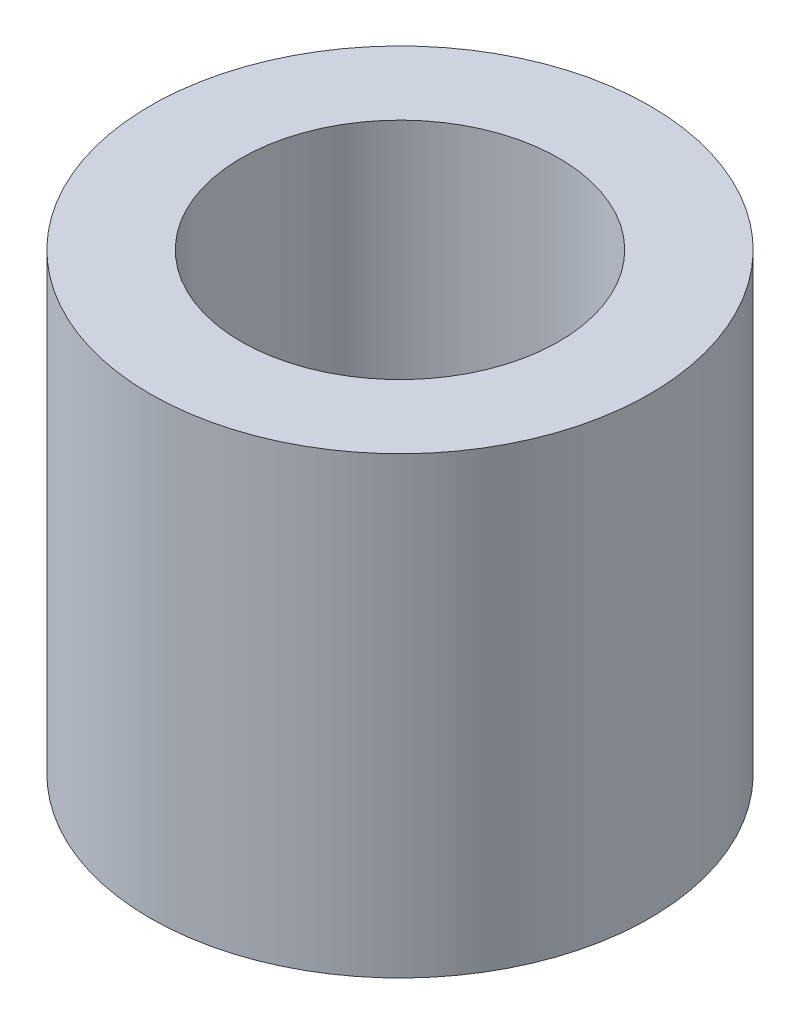
ISO-10303-21;
HEADER;
FILE_DESCRIPTION(('STEP AP214'),'2;1');
FILE_NAME('part.step','',(''),(''),'','','');
FILE_SCHEMA(('AUTOMOTIVE_DESIGN { 1 0 10303 214 1 1 1 1 }'));
ENDSEC;
DATA;
#1=APPLICATION_CONTEXT('core data for automotive mechanical design processes');
#2=APPLICATION_PROTOCOL_DEFINITION('international standard','automotive_design',2000,#1);
#3=PRODUCT_CONTEXT('',#1,'mechanical');
#4=PRODUCT('Part','Part','',(#3));
#5=PRODUCT_RELATED_PRODUCT_CATEGORY('part','',(#4));
#6=PRODUCT_DEFINITION_FORMATION('','',#4);
#7=PRODUCT_DEFINITION_CONTEXT('part definition',#1,'design');
#8=PRODUCT_DEFINITION('design','',#6,#7);
#9=PRODUCT_DEFINITION_SHAPE('','',#8);
#10=(LENGTH_UNIT() NAMED_UNIT(*) SI_UNIT(.MILLI.,.METRE.));
#11=(NAMED_UNIT(*) PLANE_ANGLE_UNIT() SI_UNIT($,.RADIAN.));
#12=(NAMED_UNIT(*) SI_UNIT($,.STERADIAN.) SOLID_ANGLE_UNIT());
#13=UNCERTAINTY_MEASURE_WITH_UNIT(LENGTH_MEASURE(1.E-05),#10,'distance_accuracy_value','');
#14=(GEOMETRIC_REPRESENTATION_CONTEXT(3) GLOBAL_UNCERTAINTY_ASSIGNED_CONTEXT((#13)) GLOBAL_UNIT_ASSIGNED_CONTEXT((#10,
#11,#12)) REPRESENTATION_CONTEXT('',''));
#15=CARTESIAN_POINT('',(0.,0.,0.));
#16=DIRECTION('',(0.,0.,1.));
#17=DIRECTION('',(1.,0.,0.));
#18=AXIS2_PLACEMENT_3D('',#15,#16,#17);
#19=CARTESIAN_POINT('',(0.,10.,0.));
#20=DIRECTION('',(0.,1.,0.));
#21=DIRECTION('',(0.,0.,1.));
#22=AXIS2_PLACEMENT_3D('',#19,#20,#21);
#23=PLANE('',#22);
#24=CARTESIAN_POINT('',(0.,10.,0.));
#25=DIRECTION('',(0.,1.,0.));
#26=DIRECTION('',(0.,0.,1.));
#27=AXIS2_PLACEMENT_3D('',#24,#25,#26);
#28=CIRCLE('',#27,5.5);
#29=CARTESIAN_POINT('',(0.,10.,5.5));
#30=VERTEX_POINT('',#29);
#31=EDGE_CURVE('E10',#30,#30,#28,.T.);
#32=ORIENTED_EDGE('',*,*,#31,.T.);
#33=EDGE_LOOP('',(#32));
#34=FACE_BOUND('',#33,.T.);
#35=CARTESIAN_POINT('',(0.,10.,0.));
#36=DIRECTION('',(0.,1.,0.));
#37=DIRECTION('',(0.,0.,1.));
#38=AXIS2_PLACEMENT_3D('',#35,#36,#37);
#39=CIRCLE('',#38,3.5);
#40=CARTESIAN_POINT('',(0.,10.,3.5));
#41=VERTEX_POINT('',#40);
#42=EDGE_CURVE('E42',#41,#41,#39,.T.);
#43=ORIENTED_EDGE('',*,*,#42,.F.);
#44=EDGE_LOOP('',(#43));
#45=FACE_BOUND('',#44,.T.);
#46=ADVANCED_FACE('F31',(#34,#45),#23,.T.);
#47=CARTESIAN_POINT('',(0.,0.,0.));
#48=DIRECTION('',(0.,1.,0.));
#49=DIRECTION('',(0.,0.,1.));
#50=AXIS2_PLACEMENT_3D('',#47,#48,#49);
#51=PLANE('',#50);
#52=CARTESIAN_POINT('',(0.,0.,0.));
#53=DIRECTION('',(0.,1.,0.));
#54=DIRECTION('',(0.,0.,1.));
#55=AXIS2_PLACEMENT_3D('',#52,#53,#54);
#56=CIRCLE('',#55,5.5);
#57=CARTESIAN_POINT('',(0.,0.,5.5));
#58=VERTEX_POINT('',#57);
#59=EDGE_CURVE('E35',#58,#58,#56,.T.);
#60=ORIENTED_EDGE('',*,*,#59,.F.);
#61=EDGE_LOOP('',(#60));
#62=FACE_BOUND('',#61,.T.);
#63=CARTESIAN_POINT('',(0.,0.,0.));
#64=DIRECTION('',(0.,1.,0.));
#65=DIRECTION('',(0.,0.,1.));
#66=AXIS2_PLACEMENT_3D('',#63,#64,#65);
#67=CIRCLE('',#66,3.5);
#68=CARTESIAN_POINT('',(0.,0.,3.5));
#69=VERTEX_POINT('',#68);
#70=EDGE_CURVE('E44',#69,#69,#67,.T.);
#71=ORIENTED_EDGE('',*,*,#70,.T.);
#72=EDGE_LOOP('',(#71));
#73=FACE_BOUND('',#72,.T.);
#74=ADVANCED_FACE('F54',(#62,#73),#51,.F.);
#75=CARTESIAN_POINT('',(0.,10.,0.));
#76=DIRECTION('',(0.,-1.,0.));
#77=DIRECTION('',(0.,0.,-1.));
#78=AXIS2_PLACEMENT_3D('',#75,#76,#77);
#79=CYLINDRICAL_SURFACE('',#78,5.5);
#80=ORIENTED_EDGE('',*,*,#31,.F.);
#81=EDGE_LOOP('',(#80));
#82=FACE_BOUND('',#81,.T.);
#83=ORIENTED_EDGE('',*,*,#59,.T.);
#84=EDGE_LOOP('',(#83));
#85=FACE_BOUND('',#84,.T.);
#86=ADVANCED_FACE('F33',(#82,#85),#79,.T.);
#87=CARTESIAN_POINT('',(0.,10.,0.));
#88=DIRECTION('',(0.,-1.,0.));
#89=DIRECTION('',(0.,0.,-1.));
#90=AXIS2_PLACEMENT_3D('',#87,#88,#89);
#91=CYLINDRICAL_SURFACE('',#90,3.5);
#92=ORIENTED_EDGE('',*,*,#42,.T.);
#93=EDGE_LOOP('',(#92));
#94=FACE_BOUND('',#93,.T.);
#95=ORIENTED_EDGE('',*,*,#70,.F.);
#96=EDGE_LOOP('',(#95));
#97=FACE_BOUND('',#96,.T.);
#98=ADVANCED_FACE('F50',(#94,#97),#91,.F.);
#99=CLOSED_SHELL('',(#46,#74,#86,#98));
#100=MANIFOLD_SOLID_BREP('B2',#99);
#101=ADVANCED_BREP_SHAPE_REPRESENTATION('',(#18,#100),#14);
#102=SHAPE_DEFINITION_REPRESENTATION(#9,#101);
ENDSEC;
END-ISO-10303-21;
